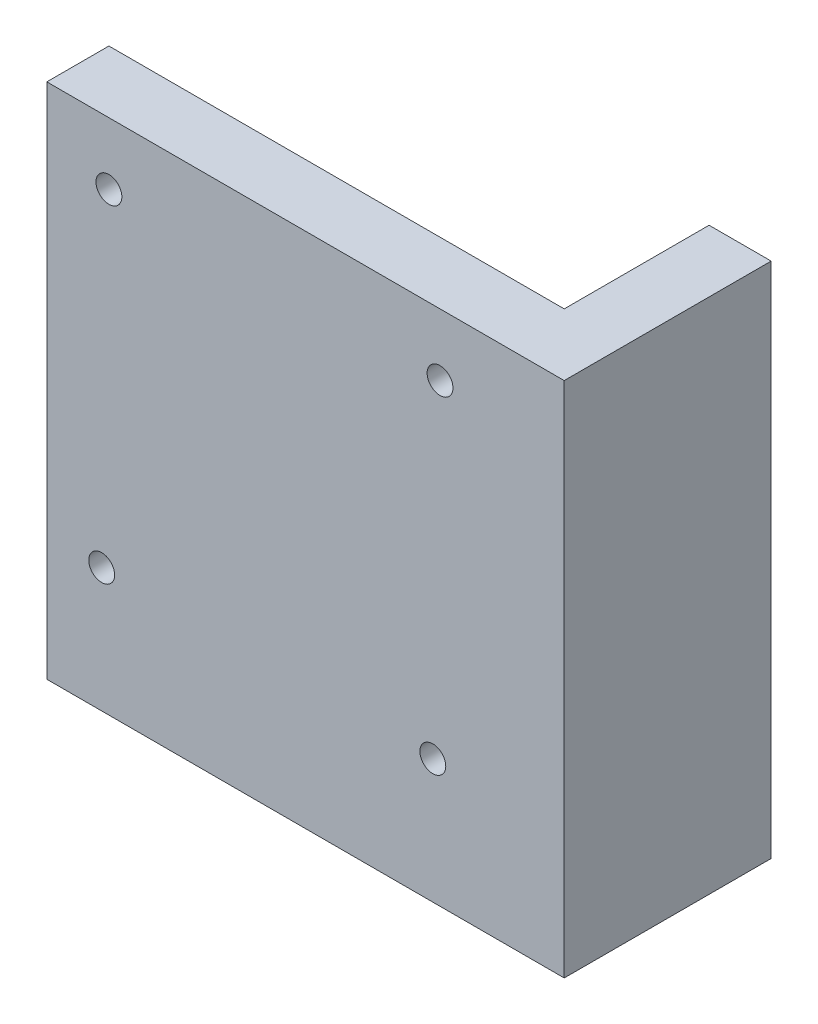
ISO-10303-21;
HEADER;
FILE_DESCRIPTION(('STEP AP214'),'2;1');
FILE_NAME('part.step','',(''),(''),'','','');
FILE_SCHEMA(('AUTOMOTIVE_DESIGN { 1 0 10303 214 1 1 1 1 }'));
ENDSEC;
DATA;
#1=APPLICATION_CONTEXT('core data for automotive mechanical design processes');
#2=APPLICATION_PROTOCOL_DEFINITION('international standard','automotive_design',2000,#1);
#3=PRODUCT_CONTEXT('',#1,'mechanical');
#4=PRODUCT('Part','Part','',(#3));
#5=PRODUCT_RELATED_PRODUCT_CATEGORY('part','',(#4));
#6=PRODUCT_DEFINITION_FORMATION('','',#4);
#7=PRODUCT_DEFINITION_CONTEXT('part definition',#1,'design');
#8=PRODUCT_DEFINITION('design','',#6,#7);
#9=PRODUCT_DEFINITION_SHAPE('','',#8);
#10=(LENGTH_UNIT() NAMED_UNIT(*) SI_UNIT(.MILLI.,.METRE.));
#11=(NAMED_UNIT(*) PLANE_ANGLE_UNIT() SI_UNIT($,.RADIAN.));
#12=(NAMED_UNIT(*) SI_UNIT($,.STERADIAN.) SOLID_ANGLE_UNIT());
#13=UNCERTAINTY_MEASURE_WITH_UNIT(LENGTH_MEASURE(1.E-05),#10,'distance_accuracy_value','');
#14=(GEOMETRIC_REPRESENTATION_CONTEXT(3) GLOBAL_UNCERTAINTY_ASSIGNED_CONTEXT((#13)) GLOBAL_UNIT_ASSIGNED_CONTEXT((#10,
#11,#12)) REPRESENTATION_CONTEXT('',''));
#15=CARTESIAN_POINT('',(0.,0.,0.));
#16=DIRECTION('',(0.,0.,1.));
#17=DIRECTION('',(1.,0.,0.));
#18=AXIS2_PLACEMENT_3D('',#15,#16,#17);
#19=CARTESIAN_POINT('',(0.,6.,0.));
#20=DIRECTION('',(0.,-1.,0.));
#21=DIRECTION('',(0.,0.,-1.));
#22=AXIS2_PLACEMENT_3D('',#19,#20,#21);
#23=PLANE('',#22);
#24=DIRECTION('',(-1.,0.,0.));
#25=VECTOR('',#24,1.);
#26=CARTESIAN_POINT('',(44.,6.,-6.));
#27=LINE('',#26,#25);
#28=CARTESIAN_POINT('',(44.,6.,-6.));
#29=VERTEX_POINT('',#28);
#30=CARTESIAN_POINT('',(0.,6.,-5.99999999999999));
#31=VERTEX_POINT('',#30);
#32=EDGE_CURVE('E122',#29,#31,#27,.T.);
#33=ORIENTED_EDGE('',*,*,#32,.F.);
#34=DIRECTION('',(0.,0.,1.));
#35=VECTOR('',#34,1.);
#36=CARTESIAN_POINT('',(44.,6.,0.));
#37=LINE('',#36,#35);
#38=CARTESIAN_POINT('',(44.,6.,-20.));
#39=VERTEX_POINT('',#38);
#40=EDGE_CURVE('E54',#39,#29,#37,.T.);
#41=ORIENTED_EDGE('',*,*,#40,.F.);
#42=DIRECTION('',(-1.,0.,0.));
#43=VECTOR('',#42,1.);
#44=CARTESIAN_POINT('',(0.,6.,-20.));
#45=LINE('',#44,#43);
#46=CARTESIAN_POINT('',(0.,6.,-20.));
#47=VERTEX_POINT('',#46);
#48=EDGE_CURVE('E59',#39,#47,#45,.T.);
#49=ORIENTED_EDGE('',*,*,#48,.T.);
#50=DIRECTION('',(0.,0.,1.));
#51=VECTOR('',#50,1.);
#52=CARTESIAN_POINT('',(0.,6.,0.));
#53=LINE('',#52,#51);
#54=EDGE_CURVE('E104',#47,#31,#53,.T.);
#55=ORIENTED_EDGE('',*,*,#54,.T.);
#56=EDGE_LOOP('',(#33,#41,#49,#55));
#57=FACE_BOUND('',#56,.T.);
#58=ADVANCED_FACE('F37',(#57),#23,.F.);
#59=CARTESIAN_POINT('',(44.,50.,0.));
#60=DIRECTION('',(1.,0.,0.));
#61=DIRECTION('',(0.,0.,-1.));
#62=AXIS2_PLACEMENT_3D('',#59,#60,#61);
#63=PLANE('',#62);
#64=DIRECTION('',(0.,-1.,0.));
#65=VECTOR('',#64,1.);
#66=CARTESIAN_POINT('',(44.,50.,-6.));
#67=LINE('',#66,#65);
#68=CARTESIAN_POINT('',(44.,50.,-6.));
#69=VERTEX_POINT('',#68);
#70=EDGE_CURVE('E140',#69,#29,#67,.T.);
#71=ORIENTED_EDGE('',*,*,#70,.F.);
#72=DIRECTION('',(0.,0.,1.));
#73=VECTOR('',#72,1.);
#74=CARTESIAN_POINT('',(44.,50.,0.));
#75=LINE('',#74,#73);
#76=CARTESIAN_POINT('',(44.,50.,-20.));
#77=VERTEX_POINT('',#76);
#78=EDGE_CURVE('E145',#77,#69,#75,.T.);
#79=ORIENTED_EDGE('',*,*,#78,.F.);
#80=DIRECTION('',(0.,-1.,0.));
#81=VECTOR('',#80,1.);
#82=CARTESIAN_POINT('',(44.,50.,-20.));
#83=LINE('',#82,#81);
#84=EDGE_CURVE('E151',#77,#39,#83,.T.);
#85=ORIENTED_EDGE('',*,*,#84,.T.);
#86=ORIENTED_EDGE('',*,*,#40,.T.);
#87=EDGE_LOOP('',(#71,#79,#85,#86));
#88=FACE_BOUND('',#87,.T.);
#89=ADVANCED_FACE('F169',(#88),#63,.F.);
#90=CARTESIAN_POINT('',(0.,6.,0.));
#91=DIRECTION('',(1.,0.,0.));
#92=DIRECTION('',(0.,0.,-1.));
#93=AXIS2_PLACEMENT_3D('',#90,#91,#92);
#94=PLANE('',#93);
#95=DIRECTION('',(0.,0.,1.));
#96=VECTOR('',#95,1.);
#97=CARTESIAN_POINT('',(0.,0.,0.));
#98=LINE('',#97,#96);
#99=CARTESIAN_POINT('',(0.,0.,-20.));
#100=VERTEX_POINT('',#99);
#101=CARTESIAN_POINT('',(0.,0.,0.));
#102=VERTEX_POINT('',#101);
#103=EDGE_CURVE('E103',#100,#102,#98,.T.);
#104=ORIENTED_EDGE('',*,*,#103,.T.);
#105=DIRECTION('',(0.,-1.,0.));
#106=VECTOR('',#105,1.);
#107=CARTESIAN_POINT('',(0.,6.,0.));
#108=LINE('',#107,#106);
#109=CARTESIAN_POINT('',(0.,50.,0.));
#110=VERTEX_POINT('',#109);
#111=EDGE_CURVE('E11',#110,#102,#108,.T.);
#112=ORIENTED_EDGE('',*,*,#111,.F.);
#113=DIRECTION('',(0.,0.,1.));
#114=VECTOR('',#113,1.);
#115=CARTESIAN_POINT('',(0.,50.,0.));
#116=LINE('',#115,#114);
#117=CARTESIAN_POINT('',(0.,50.,-5.99999999999999));
#118=VERTEX_POINT('',#117);
#119=EDGE_CURVE('E134',#118,#110,#116,.T.);
#120=ORIENTED_EDGE('',*,*,#119,.F.);
#121=DIRECTION('',(0.,-1.,0.));
#122=VECTOR('',#121,1.);
#123=CARTESIAN_POINT('',(0.,50.,-5.99999999999999));
#124=LINE('',#123,#122);
#125=EDGE_CURVE('E138',#118,#31,#124,.T.);
#126=ORIENTED_EDGE('',*,*,#125,.T.);
#127=ORIENTED_EDGE('',*,*,#54,.F.);
#128=DIRECTION('',(0.,-1.,0.));
#129=VECTOR('',#128,1.);
#130=CARTESIAN_POINT('',(0.,6.,-20.));
#131=LINE('',#130,#129);
#132=EDGE_CURVE('E98',#47,#100,#131,.T.);
#133=ORIENTED_EDGE('',*,*,#132,.T.);
#134=EDGE_LOOP('',(#104,#112,#120,#126,#127,#133));
#135=FACE_BOUND('',#134,.T.);
#136=ADVANCED_FACE('F39',(#135),#94,.F.);
#137=CARTESIAN_POINT('',(0.,6.,0.));
#138=DIRECTION('',(0.,0.,-1.));
#139=DIRECTION('',(-1.,0.,0.));
#140=AXIS2_PLACEMENT_3D('',#137,#138,#139);
#141=PLANE('',#140);
#142=CARTESIAN_POINT('',(38.,44.,0.));
#143=DIRECTION('',(0.,0.,1.));
#144=DIRECTION('',(1.,0.,0.));
#145=AXIS2_PLACEMENT_3D('',#142,#143,#144);
#146=CIRCLE('',#145,1.25);
#147=CARTESIAN_POINT('',(39.25,44.,0.));
#148=VERTEX_POINT('',#147);
#149=EDGE_CURVE('E206',#148,#148,#146,.T.);
#150=ORIENTED_EDGE('',*,*,#149,.F.);
#151=EDGE_LOOP('',(#150));
#152=FACE_BOUND('',#151,.T.);
#153=CARTESIAN_POINT('',(5.30244823425083,12.,0.));
#154=DIRECTION('',(0.,0.,1.));
#155=DIRECTION('',(1.,0.,0.));
#156=AXIS2_PLACEMENT_3D('',#153,#154,#155);
#157=CIRCLE('',#156,1.25);
#158=CARTESIAN_POINT('',(6.55244823425083,12.,0.));
#159=VERTEX_POINT('',#158);
#160=EDGE_CURVE('E210',#159,#159,#157,.T.);
#161=ORIENTED_EDGE('',*,*,#160,.F.);
#162=EDGE_LOOP('',(#161));
#163=FACE_BOUND('',#162,.T.);
#164=CARTESIAN_POINT('',(37.3024482342508,12.,0.));
#165=DIRECTION('',(0.,0.,1.));
#166=DIRECTION('',(1.,0.,0.));
#167=AXIS2_PLACEMENT_3D('',#164,#165,#166);
#168=CIRCLE('',#167,1.25);
#169=CARTESIAN_POINT('',(38.5524482342508,12.,0.));
#170=VERTEX_POINT('',#169);
#171=EDGE_CURVE('E214',#170,#170,#168,.T.);
#172=ORIENTED_EDGE('',*,*,#171,.F.);
#173=EDGE_LOOP('',(#172));
#174=FACE_BOUND('',#173,.T.);
#175=CARTESIAN_POINT('',(6.,44.,0.));
#176=DIRECTION('',(0.,0.,1.));
#177=DIRECTION('',(1.,0.,0.));
#178=AXIS2_PLACEMENT_3D('',#175,#176,#177);
#179=CIRCLE('',#178,1.25);
#180=CARTESIAN_POINT('',(7.25,44.,0.));
#181=VERTEX_POINT('',#180);
#182=EDGE_CURVE('E115',#181,#181,#179,.T.);
#183=ORIENTED_EDGE('',*,*,#182,.F.);
#184=EDGE_LOOP('',(#183));
#185=FACE_BOUND('',#184,.T.);
#186=DIRECTION('',(1.,0.,0.));
#187=VECTOR('',#186,1.);
#188=CARTESIAN_POINT('',(0.,0.,0.));
#189=LINE('',#188,#187);
#190=CARTESIAN_POINT('',(50.,0.,0.));
#191=VERTEX_POINT('',#190);
#192=EDGE_CURVE('E89',#102,#191,#189,.T.);
#193=ORIENTED_EDGE('',*,*,#192,.T.);
#194=DIRECTION('',(0.,-1.,0.));
#195=VECTOR('',#194,1.);
#196=CARTESIAN_POINT('',(50.,6.,0.));
#197=LINE('',#196,#195);
#198=CARTESIAN_POINT('',(50.,50.,0.));
#199=VERTEX_POINT('',#198);
#200=EDGE_CURVE('E46',#199,#191,#197,.T.);
#201=ORIENTED_EDGE('',*,*,#200,.F.);
#202=DIRECTION('',(1.,0.,0.));
#203=VECTOR('',#202,1.);
#204=CARTESIAN_POINT('',(50.,50.,0.));
#205=LINE('',#204,#203);
#206=EDGE_CURVE('E148',#110,#199,#205,.T.);
#207=ORIENTED_EDGE('',*,*,#206,.F.);
#208=ORIENTED_EDGE('',*,*,#111,.T.);
#209=EDGE_LOOP('',(#193,#201,#207,#208));
#210=FACE_BOUND('',#209,.T.);
#211=ADVANCED_FACE('F157',(#152,#163,#174,#185,#210),#141,.F.);
#212=CARTESIAN_POINT('',(50.,6.,0.));
#213=DIRECTION('',(-1.,0.,0.));
#214=DIRECTION('',(0.,0.,1.));
#215=AXIS2_PLACEMENT_3D('',#212,#213,#214);
#216=PLANE('',#215);
#217=DIRECTION('',(0.,0.,-1.));
#218=VECTOR('',#217,1.);
#219=CARTESIAN_POINT('',(50.,0.,0.));
#220=LINE('',#219,#218);
#221=CARTESIAN_POINT('',(50.,0.,-20.));
#222=VERTEX_POINT('',#221);
#223=EDGE_CURVE('E78',#191,#222,#220,.T.);
#224=ORIENTED_EDGE('',*,*,#223,.T.);
#225=DIRECTION('',(0.,-1.,0.));
#226=VECTOR('',#225,1.);
#227=CARTESIAN_POINT('',(50.,6.,-20.));
#228=LINE('',#227,#226);
#229=CARTESIAN_POINT('',(50.,50.,-20.));
#230=VERTEX_POINT('',#229);
#231=EDGE_CURVE('E83',#230,#222,#228,.T.);
#232=ORIENTED_EDGE('',*,*,#231,.F.);
#233=DIRECTION('',(0.,0.,-1.));
#234=VECTOR('',#233,1.);
#235=CARTESIAN_POINT('',(50.,50.,0.));
#236=LINE('',#235,#234);
#237=EDGE_CURVE('E142',#199,#230,#236,.T.);
#238=ORIENTED_EDGE('',*,*,#237,.F.);
#239=ORIENTED_EDGE('',*,*,#200,.T.);
#240=EDGE_LOOP('',(#224,#232,#238,#239));
#241=FACE_BOUND('',#240,.T.);
#242=ADVANCED_FACE('F80',(#241),#216,.F.);
#243=CARTESIAN_POINT('',(0.,6.,-20.));
#244=DIRECTION('',(0.,0.,1.));
#245=DIRECTION('',(1.,0.,0.));
#246=AXIS2_PLACEMENT_3D('',#243,#244,#245);
#247=PLANE('',#246);
#248=DIRECTION('',(-1.,0.,0.));
#249=VECTOR('',#248,1.);
#250=CARTESIAN_POINT('',(0.,0.,-20.));
#251=LINE('',#250,#249);
#252=EDGE_CURVE('E88',#222,#100,#251,.T.);
#253=ORIENTED_EDGE('',*,*,#252,.T.);
#254=ORIENTED_EDGE('',*,*,#132,.F.);
#255=ORIENTED_EDGE('',*,*,#48,.F.);
#256=ORIENTED_EDGE('',*,*,#84,.F.);
#257=DIRECTION('',(-1.,0.,0.));
#258=VECTOR('',#257,1.);
#259=CARTESIAN_POINT('',(50.,50.,-20.));
#260=LINE('',#259,#258);
#261=EDGE_CURVE('E96',#230,#77,#260,.T.);
#262=ORIENTED_EDGE('',*,*,#261,.F.);
#263=ORIENTED_EDGE('',*,*,#231,.T.);
#264=EDGE_LOOP('',(#253,#254,#255,#256,#262,#263));
#265=FACE_BOUND('',#264,.T.);
#266=ADVANCED_FACE('F92',(#265),#247,.F.);
#267=CARTESIAN_POINT('',(0.,0.,0.));
#268=DIRECTION('',(0.,-1.,0.));
#269=DIRECTION('',(0.,0.,-1.));
#270=AXIS2_PLACEMENT_3D('',#267,#268,#269);
#271=PLANE('',#270);
#272=ORIENTED_EDGE('',*,*,#103,.F.);
#273=ORIENTED_EDGE('',*,*,#252,.F.);
#274=ORIENTED_EDGE('',*,*,#223,.F.);
#275=ORIENTED_EDGE('',*,*,#192,.F.);
#276=EDGE_LOOP('',(#272,#273,#274,#275));
#277=FACE_BOUND('',#276,.T.);
#278=ADVANCED_FACE('F101',(#277),#271,.T.);
#279=CARTESIAN_POINT('',(0.,50.,0.));
#280=DIRECTION('',(0.,1.,0.));
#281=DIRECTION('',(0.,0.,1.));
#282=AXIS2_PLACEMENT_3D('',#279,#280,#281);
#283=PLANE('',#282);
#284=ORIENTED_EDGE('',*,*,#237,.T.);
#285=ORIENTED_EDGE('',*,*,#261,.T.);
#286=ORIENTED_EDGE('',*,*,#78,.T.);
#287=DIRECTION('',(-1.,0.,0.));
#288=VECTOR('',#287,1.);
#289=CARTESIAN_POINT('',(44.,50.,-6.));
#290=LINE('',#289,#288);
#291=EDGE_CURVE('E126',#69,#118,#290,.T.);
#292=ORIENTED_EDGE('',*,*,#291,.T.);
#293=ORIENTED_EDGE('',*,*,#119,.T.);
#294=ORIENTED_EDGE('',*,*,#206,.T.);
#295=EDGE_LOOP('',(#284,#285,#286,#292,#293,#294));
#296=FACE_BOUND('',#295,.T.);
#297=ADVANCED_FACE('F173',(#296),#283,.T.);
#298=CARTESIAN_POINT('',(44.,50.,-6.));
#299=DIRECTION('',(0.,0.,1.));
#300=DIRECTION('',(1.,0.,0.));
#301=AXIS2_PLACEMENT_3D('',#298,#299,#300);
#302=PLANE('',#301);
#303=CARTESIAN_POINT('',(38.,44.,-6.));
#304=DIRECTION('',(0.,0.,1.));
#305=DIRECTION('',(1.,0.,0.));
#306=AXIS2_PLACEMENT_3D('',#303,#304,#305);
#307=CIRCLE('',#306,1.25);
#308=CARTESIAN_POINT('',(39.25,44.,-6.));
#309=VERTEX_POINT('',#308);
#310=EDGE_CURVE('E41',#309,#309,#307,.T.);
#311=ORIENTED_EDGE('',*,*,#310,.T.);
#312=EDGE_LOOP('',(#311));
#313=FACE_BOUND('',#312,.T.);
#314=CARTESIAN_POINT('',(5.30244823425083,12.,-5.99999999999999));
#315=DIRECTION('',(0.,0.,1.));
#316=DIRECTION('',(1.,0.,0.));
#317=AXIS2_PLACEMENT_3D('',#314,#315,#316);
#318=CIRCLE('',#317,1.25);
#319=CARTESIAN_POINT('',(6.55244823425083,12.,-5.99999999999999));
#320=VERTEX_POINT('',#319);
#321=EDGE_CURVE('E117',#320,#320,#318,.T.);
#322=ORIENTED_EDGE('',*,*,#321,.T.);
#323=EDGE_LOOP('',(#322));
#324=FACE_BOUND('',#323,.T.);
#325=CARTESIAN_POINT('',(37.3024482342508,12.,-6.));
#326=DIRECTION('',(0.,0.,1.));
#327=DIRECTION('',(1.,0.,0.));
#328=AXIS2_PLACEMENT_3D('',#325,#326,#327);
#329=CIRCLE('',#328,1.25);
#330=CARTESIAN_POINT('',(38.5524482342508,12.,-6.));
#331=VERTEX_POINT('',#330);
#332=EDGE_CURVE('E114',#331,#331,#329,.T.);
#333=ORIENTED_EDGE('',*,*,#332,.T.);
#334=EDGE_LOOP('',(#333));
#335=FACE_BOUND('',#334,.T.);
#336=CARTESIAN_POINT('',(6.,44.,-5.99999999999999));
#337=DIRECTION('',(0.,0.,1.));
#338=DIRECTION('',(1.,0.,0.));
#339=AXIS2_PLACEMENT_3D('',#336,#337,#338);
#340=CIRCLE('',#339,1.25);
#341=CARTESIAN_POINT('',(7.25,44.,-5.99999999999999));
#342=VERTEX_POINT('',#341);
#343=EDGE_CURVE('E111',#342,#342,#340,.T.);
#344=ORIENTED_EDGE('',*,*,#343,.T.);
#345=EDGE_LOOP('',(#344));
#346=FACE_BOUND('',#345,.T.);
#347=ORIENTED_EDGE('',*,*,#32,.T.);
#348=ORIENTED_EDGE('',*,*,#125,.F.);
#349=ORIENTED_EDGE('',*,*,#291,.F.);
#350=ORIENTED_EDGE('',*,*,#70,.T.);
#351=EDGE_LOOP('',(#347,#348,#349,#350));
#352=FACE_BOUND('',#351,.T.);
#353=ADVANCED_FACE('F182',(#313,#324,#335,#346,#352),#302,.F.);
#354=CARTESIAN_POINT('',(6.,44.,-20.));
#355=DIRECTION('',(0.,0.,1.));
#356=DIRECTION('',(1.,0.,0.));
#357=AXIS2_PLACEMENT_3D('',#354,#355,#356);
#358=CYLINDRICAL_SURFACE('',#357,1.25);
#359=ORIENTED_EDGE('',*,*,#182,.T.);
#360=EDGE_LOOP('',(#359));
#361=FACE_BOUND('',#360,.T.);
#362=ORIENTED_EDGE('',*,*,#343,.F.);
#363=EDGE_LOOP('',(#362));
#364=FACE_BOUND('',#363,.T.);
#365=ADVANCED_FACE('F227',(#361,#364),#358,.F.);
#366=CARTESIAN_POINT('',(37.3024482342508,12.,-20.));
#367=DIRECTION('',(0.,0.,1.));
#368=DIRECTION('',(1.,0.,0.));
#369=AXIS2_PLACEMENT_3D('',#366,#367,#368);
#370=CYLINDRICAL_SURFACE('',#369,1.25);
#371=ORIENTED_EDGE('',*,*,#171,.T.);
#372=EDGE_LOOP('',(#371));
#373=FACE_BOUND('',#372,.T.);
#374=ORIENTED_EDGE('',*,*,#332,.F.);
#375=EDGE_LOOP('',(#374));
#376=FACE_BOUND('',#375,.T.);
#377=ADVANCED_FACE('F223',(#373,#376),#370,.F.);
#378=CARTESIAN_POINT('',(5.30244823425083,12.,-20.));
#379=DIRECTION('',(0.,0.,1.));
#380=DIRECTION('',(1.,0.,0.));
#381=AXIS2_PLACEMENT_3D('',#378,#379,#380);
#382=CYLINDRICAL_SURFACE('',#381,1.25);
#383=ORIENTED_EDGE('',*,*,#160,.T.);
#384=EDGE_LOOP('',(#383));
#385=FACE_BOUND('',#384,.T.);
#386=ORIENTED_EDGE('',*,*,#321,.F.);
#387=EDGE_LOOP('',(#386));
#388=FACE_BOUND('',#387,.T.);
#389=ADVANCED_FACE('F226',(#385,#388),#382,.F.);
#390=CARTESIAN_POINT('',(38.,44.,-20.));
#391=DIRECTION('',(0.,0.,1.));
#392=DIRECTION('',(1.,0.,0.));
#393=AXIS2_PLACEMENT_3D('',#390,#391,#392);
#394=CYLINDRICAL_SURFACE('',#393,1.25);
#395=ORIENTED_EDGE('',*,*,#149,.T.);
#396=EDGE_LOOP('',(#395));
#397=FACE_BOUND('',#396,.T.);
#398=ORIENTED_EDGE('',*,*,#310,.F.);
#399=EDGE_LOOP('',(#398));
#400=FACE_BOUND('',#399,.T.);
#401=ADVANCED_FACE('F272',(#397,#400),#394,.F.);
#402=CLOSED_SHELL('',(#58,#89,#136,#211,#242,#266,#278,#297,#353,#365,#377,#389,#401));
#403=MANIFOLD_SOLID_BREP('B2',#402);
#404=ADVANCED_BREP_SHAPE_REPRESENTATION('',(#18,#403),#14);
#405=SHAPE_DEFINITION_REPRESENTATION(#9,#404);
ENDSEC;
END-ISO-10303-21;
